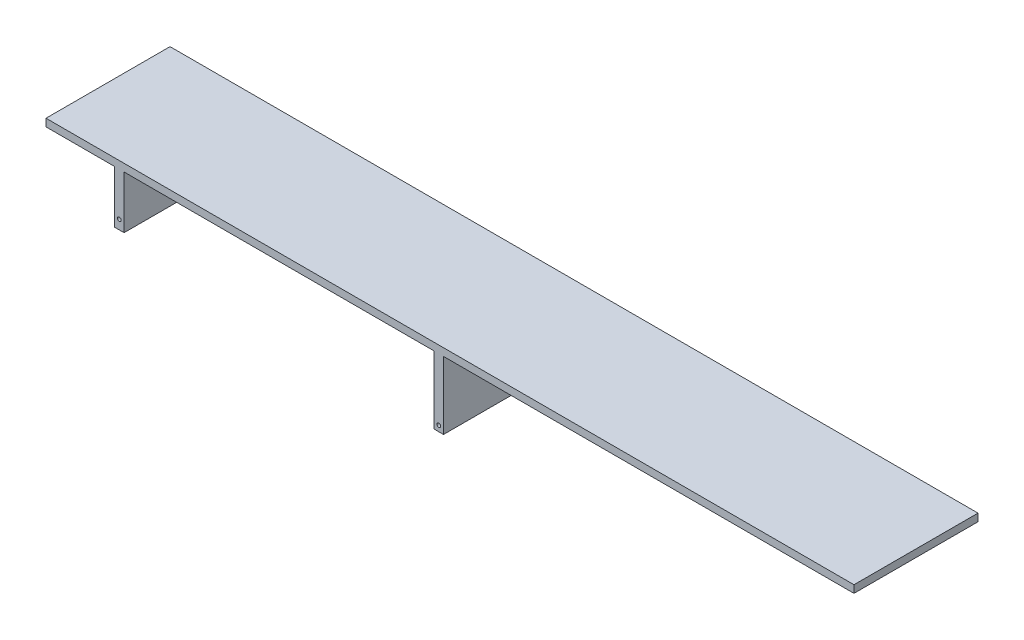
ISO-10303-21;
HEADER;
FILE_DESCRIPTION(('STEP AP214'),'2;1');
FILE_NAME('part.step','',(''),(''),'','','');
FILE_SCHEMA(('AUTOMOTIVE_DESIGN { 1 0 10303 214 1 1 1 1 }'));
ENDSEC;
DATA;
#1=APPLICATION_CONTEXT('core data for automotive mechanical design processes');
#2=APPLICATION_PROTOCOL_DEFINITION('international standard','automotive_design',2000,#1);
#3=PRODUCT_CONTEXT('',#1,'mechanical');
#4=PRODUCT('Part','Part','',(#3));
#5=PRODUCT_RELATED_PRODUCT_CATEGORY('part','',(#4));
#6=PRODUCT_DEFINITION_FORMATION('','',#4);
#7=PRODUCT_DEFINITION_CONTEXT('part definition',#1,'design');
#8=PRODUCT_DEFINITION('design','',#6,#7);
#9=PRODUCT_DEFINITION_SHAPE('','',#8);
#10=(LENGTH_UNIT() NAMED_UNIT(*) SI_UNIT(.MILLI.,.METRE.));
#11=(NAMED_UNIT(*) PLANE_ANGLE_UNIT() SI_UNIT($,.RADIAN.));
#12=(NAMED_UNIT(*) SI_UNIT($,.STERADIAN.) SOLID_ANGLE_UNIT());
#13=UNCERTAINTY_MEASURE_WITH_UNIT(LENGTH_MEASURE(1.E-05),#10,'distance_accuracy_value','');
#14=(GEOMETRIC_REPRESENTATION_CONTEXT(3) GLOBAL_UNCERTAINTY_ASSIGNED_CONTEXT((#13)) GLOBAL_UNIT_ASSIGNED_CONTEXT((#10,
#11,#12)) REPRESENTATION_CONTEXT('',''));
#15=CARTESIAN_POINT('',(0.,0.,0.));
#16=DIRECTION('',(0.,0.,1.));
#17=DIRECTION('',(1.,0.,0.));
#18=AXIS2_PLACEMENT_3D('',#15,#16,#17);
#19=CARTESIAN_POINT('',(-60.6162901017215,24.5801643192488,66.));
#20=DIRECTION('',(0.,0.,1.));
#21=DIRECTION('',(1.,0.,0.));
#22=AXIS2_PLACEMENT_3D('',#19,#20,#21);
#23=PLANE('',#22);
#24=CARTESIAN_POINT('',(148.429880121598,-8.41983568075118,66.));
#25=DIRECTION('',(0.,0.,1.));
#26=DIRECTION('',(1.,0.,0.));
#27=AXIS2_PLACEMENT_3D('',#24,#25,#26);
#28=CIRCLE('',#27,0.999999999999998);
#29=CARTESIAN_POINT('',(149.429880121598,-8.41983568075118,66.));
#30=VERTEX_POINT('',#29);
#31=EDGE_CURVE('E157',#30,#30,#28,.T.);
#32=ORIENTED_EDGE('',*,*,#31,.F.);
#33=EDGE_LOOP('',(#32));
#34=FACE_BOUND('',#33,.T.);
#35=DIRECTION('',(0.,-1.,0.));
#36=VECTOR('',#35,1.);
#37=CARTESIAN_POINT('',(-60.6162901017215,28.5801643192488,66.));
#38=LINE('',#37,#36);
#39=CARTESIAN_POINT('',(-60.6162901017215,28.5801643192488,66.));
#40=VERTEX_POINT('',#39);
#41=CARTESIAN_POINT('',(-60.6162901017215,24.5801643192488,66.));
#42=VERTEX_POINT('',#41);
#43=EDGE_CURVE('E176',#40,#42,#38,.T.);
#44=ORIENTED_EDGE('',*,*,#43,.T.);
#45=DIRECTION('',(1.,0.,0.));
#46=VECTOR('',#45,1.);
#47=CARTESIAN_POINT('',(-60.6162901017215,24.5801643192488,66.));
#48=LINE('',#47,#46);
#49=CARTESIAN_POINT('',(-24.0701198784021,24.5801643192488,66.));
#50=VERTEX_POINT('',#49);
#51=EDGE_CURVE('E104',#42,#50,#48,.T.);
#52=ORIENTED_EDGE('',*,*,#51,.T.);
#53=DIRECTION('',(0.,-1.,0.));
#54=VECTOR('',#53,1.);
#55=CARTESIAN_POINT('',(-24.0701198784021,24.5801643192488,66.));
#56=LINE('',#55,#54);
#57=CARTESIAN_POINT('',(-24.0701198784021,-3.41983568075118,66.));
#58=VERTEX_POINT('',#57);
#59=EDGE_CURVE('E203',#50,#58,#56,.T.);
#60=ORIENTED_EDGE('',*,*,#59,.T.);
#61=DIRECTION('',(1.,0.,0.));
#62=VECTOR('',#61,1.);
#63=CARTESIAN_POINT('',(-24.0701198784021,-3.41983568075118,66.));
#64=LINE('',#63,#62);
#65=CARTESIAN_POINT('',(-19.0701198784021,-3.41983568075118,66.));
#66=VERTEX_POINT('',#65);
#67=EDGE_CURVE('E222',#58,#66,#64,.T.);
#68=ORIENTED_EDGE('',*,*,#67,.T.);
#69=DIRECTION('',(0.,1.,0.));
#70=VECTOR('',#69,1.);
#71=CARTESIAN_POINT('',(-19.0701198784021,24.5801643192488,66.));
#72=LINE('',#71,#70);
#73=CARTESIAN_POINT('',(-19.0701198784021,24.5801643192488,66.));
#74=VERTEX_POINT('',#73);
#75=EDGE_CURVE('E219',#66,#74,#72,.T.);
#76=ORIENTED_EDGE('',*,*,#75,.T.);
#77=DIRECTION('',(1.,0.,0.));
#78=VECTOR('',#77,1.);
#79=CARTESIAN_POINT('',(-19.0701198784021,24.5801643192488,66.));
#80=LINE('',#79,#78);
#81=CARTESIAN_POINT('',(145.929880121598,24.5801643192488,66.));
#82=VERTEX_POINT('',#81);
#83=EDGE_CURVE('E221',#74,#82,#80,.T.);
#84=ORIENTED_EDGE('',*,*,#83,.T.);
#85=DIRECTION('',(0.,-1.,0.));
#86=VECTOR('',#85,1.);
#87=CARTESIAN_POINT('',(145.929880121598,24.5801643192488,66.));
#88=LINE('',#87,#86);
#89=CARTESIAN_POINT('',(145.929880121598,-11.4198356807512,66.));
#90=VERTEX_POINT('',#89);
#91=EDGE_CURVE('E224',#82,#90,#88,.T.);
#92=ORIENTED_EDGE('',*,*,#91,.T.);
#93=DIRECTION('',(1.,0.,0.));
#94=VECTOR('',#93,1.);
#95=CARTESIAN_POINT('',(145.929880121598,-11.4198356807512,66.));
#96=LINE('',#95,#94);
#97=CARTESIAN_POINT('',(150.929880121598,-11.4198356807512,66.));
#98=VERTEX_POINT('',#97);
#99=EDGE_CURVE('E230',#90,#98,#96,.T.);
#100=ORIENTED_EDGE('',*,*,#99,.T.);
#101=DIRECTION('',(0.,1.,0.));
#102=VECTOR('',#101,1.);
#103=CARTESIAN_POINT('',(150.929880121598,24.5801643192488,66.));
#104=LINE('',#103,#102);
#105=CARTESIAN_POINT('',(150.929880121598,24.5801643192488,66.));
#106=VERTEX_POINT('',#105);
#107=EDGE_CURVE('E135',#98,#106,#104,.T.);
#108=ORIENTED_EDGE('',*,*,#107,.T.);
#109=DIRECTION('',(1.,0.,0.));
#110=VECTOR('',#109,1.);
#111=CARTESIAN_POINT('',(150.929880121598,24.5801643192488,66.));
#112=LINE('',#111,#110);
#113=CARTESIAN_POINT('',(369.383709898279,24.5801643192488,66.));
#114=VERTEX_POINT('',#113);
#115=EDGE_CURVE('E129',#106,#114,#112,.T.);
#116=ORIENTED_EDGE('',*,*,#115,.T.);
#117=DIRECTION('',(0.,1.,0.));
#118=VECTOR('',#117,1.);
#119=CARTESIAN_POINT('',(369.383709898279,28.5801643192488,66.));
#120=LINE('',#119,#118);
#121=CARTESIAN_POINT('',(369.383709898279,28.5801643192488,66.));
#122=VERTEX_POINT('',#121);
#123=EDGE_CURVE('E133',#114,#122,#120,.T.);
#124=ORIENTED_EDGE('',*,*,#123,.T.);
#125=DIRECTION('',(-1.,0.,0.));
#126=VECTOR('',#125,1.);
#127=CARTESIAN_POINT('',(-60.6162901017215,28.5801643192488,66.));
#128=LINE('',#127,#126);
#129=EDGE_CURVE('E49',#122,#40,#128,.T.);
#130=ORIENTED_EDGE('',*,*,#129,.T.);
#131=EDGE_LOOP('',(#44,#52,#60,#68,#76,#84,#92,#100,#108,#116,#124,#130));
#132=FACE_BOUND('',#131,.T.);
#133=CARTESIAN_POINT('',(-21.5701198784021,1.58016431924882,66.));
#134=DIRECTION('',(0.,0.,1.));
#135=DIRECTION('',(1.,0.,0.));
#136=AXIS2_PLACEMENT_3D('',#133,#134,#135);
#137=CIRCLE('',#136,1.);
#138=CARTESIAN_POINT('',(-20.5701198784021,1.58016431924882,66.));
#139=VERTEX_POINT('',#138);
#140=EDGE_CURVE('E273',#139,#139,#137,.T.);
#141=ORIENTED_EDGE('',*,*,#140,.F.);
#142=EDGE_LOOP('',(#141));
#143=FACE_BOUND('',#142,.T.);
#144=ADVANCED_FACE('F32',(#34,#132,#143),#23,.T.);
#145=CARTESIAN_POINT('',(-60.6162901017215,24.5801643192488,0.));
#146=DIRECTION('',(0.,0.,1.));
#147=DIRECTION('',(1.,0.,0.));
#148=AXIS2_PLACEMENT_3D('',#145,#146,#147);
#149=PLANE('',#148);
#150=CARTESIAN_POINT('',(148.429880121598,-8.41983568075118,0.));
#151=DIRECTION('',(0.,0.,1.));
#152=DIRECTION('',(1.,0.,0.));
#153=AXIS2_PLACEMENT_3D('',#150,#151,#152);
#154=CIRCLE('',#153,0.999999999999998);
#155=CARTESIAN_POINT('',(149.429880121598,-8.41983568075118,0.));
#156=VERTEX_POINT('',#155);
#157=EDGE_CURVE('E278',#156,#156,#154,.T.);
#158=ORIENTED_EDGE('',*,*,#157,.T.);
#159=EDGE_LOOP('',(#158));
#160=FACE_BOUND('',#159,.T.);
#161=DIRECTION('',(0.,-1.,0.));
#162=VECTOR('',#161,1.);
#163=CARTESIAN_POINT('',(-60.6162901017215,28.5801643192488,0.));
#164=LINE('',#163,#162);
#165=CARTESIAN_POINT('',(-60.6162901017215,28.5801643192488,0.));
#166=VERTEX_POINT('',#165);
#167=CARTESIAN_POINT('',(-60.6162901017215,24.5801643192488,0.));
#168=VERTEX_POINT('',#167);
#169=EDGE_CURVE('E153',#166,#168,#164,.T.);
#170=ORIENTED_EDGE('',*,*,#169,.F.);
#171=DIRECTION('',(-1.,0.,0.));
#172=VECTOR('',#171,1.);
#173=CARTESIAN_POINT('',(-60.6162901017215,28.5801643192488,0.));
#174=LINE('',#173,#172);
#175=CARTESIAN_POINT('',(369.383709898279,28.5801643192488,0.));
#176=VERTEX_POINT('',#175);
#177=EDGE_CURVE('E96',#176,#166,#174,.T.);
#178=ORIENTED_EDGE('',*,*,#177,.F.);
#179=DIRECTION('',(0.,1.,0.));
#180=VECTOR('',#179,1.);
#181=CARTESIAN_POINT('',(369.383709898279,28.5801643192488,0.));
#182=LINE('',#181,#180);
#183=CARTESIAN_POINT('',(369.383709898279,24.5801643192488,0.));
#184=VERTEX_POINT('',#183);
#185=EDGE_CURVE('E90',#184,#176,#182,.T.);
#186=ORIENTED_EDGE('',*,*,#185,.F.);
#187=DIRECTION('',(1.,0.,0.));
#188=VECTOR('',#187,1.);
#189=CARTESIAN_POINT('',(150.929880121598,24.5801643192488,0.));
#190=LINE('',#189,#188);
#191=CARTESIAN_POINT('',(150.929880121598,24.5801643192488,0.));
#192=VERTEX_POINT('',#191);
#193=EDGE_CURVE('E143',#192,#184,#190,.T.);
#194=ORIENTED_EDGE('',*,*,#193,.F.);
#195=DIRECTION('',(0.,1.,0.));
#196=VECTOR('',#195,1.);
#197=CARTESIAN_POINT('',(150.929880121598,24.5801643192488,0.));
#198=LINE('',#197,#196);
#199=CARTESIAN_POINT('',(150.929880121598,-11.4198356807512,0.));
#200=VERTEX_POINT('',#199);
#201=EDGE_CURVE('E171',#200,#192,#198,.T.);
#202=ORIENTED_EDGE('',*,*,#201,.F.);
#203=DIRECTION('',(1.,0.,0.));
#204=VECTOR('',#203,1.);
#205=CARTESIAN_POINT('',(145.929880121598,-11.4198356807512,0.));
#206=LINE('',#205,#204);
#207=CARTESIAN_POINT('',(145.929880121598,-11.4198356807512,0.));
#208=VERTEX_POINT('',#207);
#209=EDGE_CURVE('E169',#208,#200,#206,.T.);
#210=ORIENTED_EDGE('',*,*,#209,.F.);
#211=DIRECTION('',(0.,-1.,0.));
#212=VECTOR('',#211,1.);
#213=CARTESIAN_POINT('',(145.929880121598,24.5801643192488,0.));
#214=LINE('',#213,#212);
#215=CARTESIAN_POINT('',(145.929880121598,24.5801643192488,0.));
#216=VERTEX_POINT('',#215);
#217=EDGE_CURVE('E167',#216,#208,#214,.T.);
#218=ORIENTED_EDGE('',*,*,#217,.F.);
#219=DIRECTION('',(1.,0.,0.));
#220=VECTOR('',#219,1.);
#221=CARTESIAN_POINT('',(-19.0701198784021,24.5801643192488,0.));
#222=LINE('',#221,#220);
#223=CARTESIAN_POINT('',(-19.0701198784021,24.5801643192488,0.));
#224=VERTEX_POINT('',#223);
#225=EDGE_CURVE('E165',#224,#216,#222,.T.);
#226=ORIENTED_EDGE('',*,*,#225,.F.);
#227=DIRECTION('',(0.,1.,0.));
#228=VECTOR('',#227,1.);
#229=CARTESIAN_POINT('',(-19.0701198784021,24.5801643192488,0.));
#230=LINE('',#229,#228);
#231=CARTESIAN_POINT('',(-19.0701198784021,-3.41983568075118,0.));
#232=VERTEX_POINT('',#231);
#233=EDGE_CURVE('E163',#232,#224,#230,.T.);
#234=ORIENTED_EDGE('',*,*,#233,.F.);
#235=DIRECTION('',(1.,0.,0.));
#236=VECTOR('',#235,1.);
#237=CARTESIAN_POINT('',(-24.0701198784021,-3.41983568075118,0.));
#238=LINE('',#237,#236);
#239=CARTESIAN_POINT('',(-24.0701198784021,-3.41983568075118,0.));
#240=VERTEX_POINT('',#239);
#241=EDGE_CURVE('E161',#240,#232,#238,.T.);
#242=ORIENTED_EDGE('',*,*,#241,.F.);
#243=DIRECTION('',(0.,-1.,0.));
#244=VECTOR('',#243,1.);
#245=CARTESIAN_POINT('',(-24.0701198784021,24.5801643192488,0.));
#246=LINE('',#245,#244);
#247=CARTESIAN_POINT('',(-24.0701198784021,24.5801643192488,0.));
#248=VERTEX_POINT('',#247);
#249=EDGE_CURVE('E159',#248,#240,#246,.T.);
#250=ORIENTED_EDGE('',*,*,#249,.F.);
#251=DIRECTION('',(1.,0.,0.));
#252=VECTOR('',#251,1.);
#253=CARTESIAN_POINT('',(-60.6162901017215,24.5801643192488,0.));
#254=LINE('',#253,#252);
#255=EDGE_CURVE('E156',#168,#248,#254,.T.);
#256=ORIENTED_EDGE('',*,*,#255,.F.);
#257=EDGE_LOOP('',(#170,#178,#186,#194,#202,#210,#218,#226,#234,#242,#250,#256));
#258=FACE_BOUND('',#257,.T.);
#259=CARTESIAN_POINT('',(-21.5701198784021,1.58016431924882,0.));
#260=DIRECTION('',(0.,0.,1.));
#261=DIRECTION('',(1.,0.,0.));
#262=AXIS2_PLACEMENT_3D('',#259,#260,#261);
#263=CIRCLE('',#262,1.);
#264=CARTESIAN_POINT('',(-20.5701198784021,1.58016431924882,0.));
#265=VERTEX_POINT('',#264);
#266=EDGE_CURVE('E276',#265,#265,#263,.T.);
#267=ORIENTED_EDGE('',*,*,#266,.T.);
#268=EDGE_LOOP('',(#267));
#269=FACE_BOUND('',#268,.T.);
#270=ADVANCED_FACE('F207',(#160,#258,#269),#149,.F.);
#271=CARTESIAN_POINT('',(-60.6162901017215,28.5801643192488,66.));
#272=DIRECTION('',(1.,0.,0.));
#273=DIRECTION('',(0.,1.,0.));
#274=AXIS2_PLACEMENT_3D('',#271,#272,#273);
#275=PLANE('',#274);
#276=ORIENTED_EDGE('',*,*,#169,.T.);
#277=DIRECTION('',(0.,0.,-1.));
#278=VECTOR('',#277,1.);
#279=CARTESIAN_POINT('',(-60.6162901017215,24.5801643192488,66.));
#280=LINE('',#279,#278);
#281=EDGE_CURVE('E11',#42,#168,#280,.T.);
#282=ORIENTED_EDGE('',*,*,#281,.F.);
#283=ORIENTED_EDGE('',*,*,#43,.F.);
#284=DIRECTION('',(0.,0.,-1.));
#285=VECTOR('',#284,1.);
#286=CARTESIAN_POINT('',(-60.6162901017215,28.5801643192488,66.));
#287=LINE('',#286,#285);
#288=EDGE_CURVE('E149',#40,#166,#287,.T.);
#289=ORIENTED_EDGE('',*,*,#288,.T.);
#290=EDGE_LOOP('',(#276,#282,#283,#289));
#291=FACE_BOUND('',#290,.T.);
#292=ADVANCED_FACE('F34',(#291),#275,.F.);
#293=CARTESIAN_POINT('',(-60.6162901017215,24.5801643192488,66.));
#294=DIRECTION('',(0.,1.,0.));
#295=DIRECTION('',(0.,0.,1.));
#296=AXIS2_PLACEMENT_3D('',#293,#294,#295);
#297=PLANE('',#296);
#298=ORIENTED_EDGE('',*,*,#255,.T.);
#299=DIRECTION('',(0.,0.,-1.));
#300=VECTOR('',#299,1.);
#301=CARTESIAN_POINT('',(-24.0701198784021,24.5801643192488,66.));
#302=LINE('',#301,#300);
#303=EDGE_CURVE('E41',#50,#248,#302,.T.);
#304=ORIENTED_EDGE('',*,*,#303,.F.);
#305=ORIENTED_EDGE('',*,*,#51,.F.);
#306=ORIENTED_EDGE('',*,*,#281,.T.);
#307=EDGE_LOOP('',(#298,#304,#305,#306));
#308=FACE_BOUND('',#307,.T.);
#309=ADVANCED_FACE('F371',(#308),#297,.F.);
#310=CARTESIAN_POINT('',(-24.0701198784021,24.5801643192488,66.));
#311=DIRECTION('',(1.,0.,0.));
#312=DIRECTION('',(0.,1.,0.));
#313=AXIS2_PLACEMENT_3D('',#310,#311,#312);
#314=PLANE('',#313);
#315=ORIENTED_EDGE('',*,*,#249,.T.);
#316=DIRECTION('',(0.,0.,-1.));
#317=VECTOR('',#316,1.);
#318=CARTESIAN_POINT('',(-24.0701198784021,-3.41983568075118,66.));
#319=LINE('',#318,#317);
#320=EDGE_CURVE('E195',#58,#240,#319,.T.);
#321=ORIENTED_EDGE('',*,*,#320,.F.);
#322=ORIENTED_EDGE('',*,*,#59,.F.);
#323=ORIENTED_EDGE('',*,*,#303,.T.);
#324=EDGE_LOOP('',(#315,#321,#322,#323));
#325=FACE_BOUND('',#324,.T.);
#326=ADVANCED_FACE('F201',(#325),#314,.F.);
#327=CARTESIAN_POINT('',(-24.0701198784021,-3.41983568075118,66.));
#328=DIRECTION('',(0.,1.,0.));
#329=DIRECTION('',(0.,0.,1.));
#330=AXIS2_PLACEMENT_3D('',#327,#328,#329);
#331=PLANE('',#330);
#332=ORIENTED_EDGE('',*,*,#241,.T.);
#333=DIRECTION('',(0.,0.,-1.));
#334=VECTOR('',#333,1.);
#335=CARTESIAN_POINT('',(-19.0701198784021,-3.41983568075118,66.));
#336=LINE('',#335,#334);
#337=EDGE_CURVE('E192',#66,#232,#336,.T.);
#338=ORIENTED_EDGE('',*,*,#337,.F.);
#339=ORIENTED_EDGE('',*,*,#67,.F.);
#340=ORIENTED_EDGE('',*,*,#320,.T.);
#341=EDGE_LOOP('',(#332,#338,#339,#340));
#342=FACE_BOUND('',#341,.T.);
#343=ADVANCED_FACE('F213',(#342),#331,.F.);
#344=CARTESIAN_POINT('',(-19.0701198784021,24.5801643192488,66.));
#345=DIRECTION('',(-1.,0.,0.));
#346=DIRECTION('',(0.,-1.,0.));
#347=AXIS2_PLACEMENT_3D('',#344,#345,#346);
#348=PLANE('',#347);
#349=ORIENTED_EDGE('',*,*,#233,.T.);
#350=DIRECTION('',(0.,0.,-1.));
#351=VECTOR('',#350,1.);
#352=CARTESIAN_POINT('',(-19.0701198784021,24.5801643192488,66.));
#353=LINE('',#352,#351);
#354=EDGE_CURVE('E189',#74,#224,#353,.T.);
#355=ORIENTED_EDGE('',*,*,#354,.F.);
#356=ORIENTED_EDGE('',*,*,#75,.F.);
#357=ORIENTED_EDGE('',*,*,#337,.T.);
#358=EDGE_LOOP('',(#349,#355,#356,#357));
#359=FACE_BOUND('',#358,.T.);
#360=ADVANCED_FACE('F217',(#359),#348,.F.);
#361=CARTESIAN_POINT('',(-19.0701198784021,24.5801643192488,66.));
#362=DIRECTION('',(0.,1.,0.));
#363=DIRECTION('',(0.,0.,1.));
#364=AXIS2_PLACEMENT_3D('',#361,#362,#363);
#365=PLANE('',#364);
#366=ORIENTED_EDGE('',*,*,#225,.T.);
#367=DIRECTION('',(0.,0.,-1.));
#368=VECTOR('',#367,1.);
#369=CARTESIAN_POINT('',(145.929880121598,24.5801643192488,66.));
#370=LINE('',#369,#368);
#371=EDGE_CURVE('E186',#82,#216,#370,.T.);
#372=ORIENTED_EDGE('',*,*,#371,.F.);
#373=ORIENTED_EDGE('',*,*,#83,.F.);
#374=ORIENTED_EDGE('',*,*,#354,.T.);
#375=EDGE_LOOP('',(#366,#372,#373,#374));
#376=FACE_BOUND('',#375,.T.);
#377=ADVANCED_FACE('F336',(#376),#365,.F.);
#378=CARTESIAN_POINT('',(145.929880121598,24.5801643192488,66.));
#379=DIRECTION('',(1.,0.,0.));
#380=DIRECTION('',(0.,1.,0.));
#381=AXIS2_PLACEMENT_3D('',#378,#379,#380);
#382=PLANE('',#381);
#383=ORIENTED_EDGE('',*,*,#217,.T.);
#384=DIRECTION('',(0.,0.,-1.));
#385=VECTOR('',#384,1.);
#386=CARTESIAN_POINT('',(145.929880121598,-11.4198356807512,66.));
#387=LINE('',#386,#385);
#388=EDGE_CURVE('E183',#90,#208,#387,.T.);
#389=ORIENTED_EDGE('',*,*,#388,.F.);
#390=ORIENTED_EDGE('',*,*,#91,.F.);
#391=ORIENTED_EDGE('',*,*,#371,.T.);
#392=EDGE_LOOP('',(#383,#389,#390,#391));
#393=FACE_BOUND('',#392,.T.);
#394=ADVANCED_FACE('F327',(#393),#382,.F.);
#395=CARTESIAN_POINT('',(145.929880121598,-11.4198356807512,66.));
#396=DIRECTION('',(0.,1.,0.));
#397=DIRECTION('',(0.,0.,1.));
#398=AXIS2_PLACEMENT_3D('',#395,#396,#397);
#399=PLANE('',#398);
#400=ORIENTED_EDGE('',*,*,#209,.T.);
#401=DIRECTION('',(0.,0.,-1.));
#402=VECTOR('',#401,1.);
#403=CARTESIAN_POINT('',(150.929880121598,-11.4198356807512,66.));
#404=LINE('',#403,#402);
#405=EDGE_CURVE('E180',#98,#200,#404,.T.);
#406=ORIENTED_EDGE('',*,*,#405,.F.);
#407=ORIENTED_EDGE('',*,*,#99,.F.);
#408=ORIENTED_EDGE('',*,*,#388,.T.);
#409=EDGE_LOOP('',(#400,#406,#407,#408));
#410=FACE_BOUND('',#409,.T.);
#411=ADVANCED_FACE('F236',(#410),#399,.F.);
#412=CARTESIAN_POINT('',(150.929880121598,24.5801643192488,66.));
#413=DIRECTION('',(-1.,0.,0.));
#414=DIRECTION('',(0.,0.,1.));
#415=AXIS2_PLACEMENT_3D('',#412,#413,#414);
#416=PLANE('',#415);
#417=ORIENTED_EDGE('',*,*,#201,.T.);
#418=DIRECTION('',(0.,0.,-1.));
#419=VECTOR('',#418,1.);
#420=CARTESIAN_POINT('',(150.929880121598,24.5801643192488,66.));
#421=LINE('',#420,#419);
#422=EDGE_CURVE('E144',#106,#192,#421,.T.);
#423=ORIENTED_EDGE('',*,*,#422,.F.);
#424=ORIENTED_EDGE('',*,*,#107,.F.);
#425=ORIENTED_EDGE('',*,*,#405,.T.);
#426=EDGE_LOOP('',(#417,#423,#424,#425));
#427=FACE_BOUND('',#426,.T.);
#428=ADVANCED_FACE('F240',(#427),#416,.F.);
#429=CARTESIAN_POINT('',(150.929880121598,24.5801643192488,66.));
#430=DIRECTION('',(0.,1.,0.));
#431=DIRECTION('',(0.,0.,1.));
#432=AXIS2_PLACEMENT_3D('',#429,#430,#431);
#433=PLANE('',#432);
#434=ORIENTED_EDGE('',*,*,#193,.T.);
#435=DIRECTION('',(0.,0.,-1.));
#436=VECTOR('',#435,1.);
#437=CARTESIAN_POINT('',(369.383709898279,24.5801643192488,66.));
#438=LINE('',#437,#436);
#439=EDGE_CURVE('E140',#114,#184,#438,.T.);
#440=ORIENTED_EDGE('',*,*,#439,.F.);
#441=ORIENTED_EDGE('',*,*,#115,.F.);
#442=ORIENTED_EDGE('',*,*,#422,.T.);
#443=EDGE_LOOP('',(#434,#440,#441,#442));
#444=FACE_BOUND('',#443,.T.);
#445=ADVANCED_FACE('F141',(#444),#433,.F.);
#446=CARTESIAN_POINT('',(369.383709898279,28.5801643192488,66.));
#447=DIRECTION('',(-1.,0.,0.));
#448=DIRECTION('',(0.,0.,1.));
#449=AXIS2_PLACEMENT_3D('',#446,#447,#448);
#450=PLANE('',#449);
#451=ORIENTED_EDGE('',*,*,#185,.T.);
#452=DIRECTION('',(0.,0.,-1.));
#453=VECTOR('',#452,1.);
#454=CARTESIAN_POINT('',(369.383709898279,28.5801643192488,66.));
#455=LINE('',#454,#453);
#456=EDGE_CURVE('E145',#122,#176,#455,.T.);
#457=ORIENTED_EDGE('',*,*,#456,.F.);
#458=ORIENTED_EDGE('',*,*,#123,.F.);
#459=ORIENTED_EDGE('',*,*,#439,.T.);
#460=EDGE_LOOP('',(#451,#457,#458,#459));
#461=FACE_BOUND('',#460,.T.);
#462=ADVANCED_FACE('F147',(#461),#450,.F.);
#463=CARTESIAN_POINT('',(-60.6162901017215,28.5801643192488,66.));
#464=DIRECTION('',(0.,-1.,0.));
#465=DIRECTION('',(0.,0.,-1.));
#466=AXIS2_PLACEMENT_3D('',#463,#464,#465);
#467=PLANE('',#466);
#468=ORIENTED_EDGE('',*,*,#177,.T.);
#469=ORIENTED_EDGE('',*,*,#288,.F.);
#470=ORIENTED_EDGE('',*,*,#129,.F.);
#471=ORIENTED_EDGE('',*,*,#456,.T.);
#472=EDGE_LOOP('',(#468,#469,#470,#471));
#473=FACE_BOUND('',#472,.T.);
#474=ADVANCED_FACE('F244',(#473),#467,.F.);
#475=CARTESIAN_POINT('',(148.429880121598,-8.41983568075118,66.));
#476=DIRECTION('',(0.,0.,-1.));
#477=DIRECTION('',(-1.,0.,0.));
#478=AXIS2_PLACEMENT_3D('',#475,#476,#477);
#479=CYLINDRICAL_SURFACE('',#478,0.999999999999998);
#480=ORIENTED_EDGE('',*,*,#31,.T.);
#481=EDGE_LOOP('',(#480));
#482=FACE_BOUND('',#481,.T.);
#483=ORIENTED_EDGE('',*,*,#157,.F.);
#484=EDGE_LOOP('',(#483));
#485=FACE_BOUND('',#484,.T.);
#486=ADVANCED_FACE('F246',(#482,#485),#479,.F.);
#487=CARTESIAN_POINT('',(-21.5701198784021,1.58016431924882,66.));
#488=DIRECTION('',(0.,0.,-1.));
#489=DIRECTION('',(-1.,0.,0.));
#490=AXIS2_PLACEMENT_3D('',#487,#488,#489);
#491=CYLINDRICAL_SURFACE('',#490,1.);
#492=ORIENTED_EDGE('',*,*,#140,.T.);
#493=EDGE_LOOP('',(#492));
#494=FACE_BOUND('',#493,.T.);
#495=ORIENTED_EDGE('',*,*,#266,.F.);
#496=EDGE_LOOP('',(#495));
#497=FACE_BOUND('',#496,.T.);
#498=ADVANCED_FACE('F252',(#494,#497),#491,.F.);
#499=CLOSED_SHELL('',(#144,#270,#292,#309,#326,#343,#360,#377,#394,#411,#428,#445,#462,#474,
#486,#498));
#500=MANIFOLD_SOLID_BREP('B2',#499);
#501=ADVANCED_BREP_SHAPE_REPRESENTATION('',(#18,#500),#14);
#502=SHAPE_DEFINITION_REPRESENTATION(#9,#501);
ENDSEC;
END-ISO-10303-21;
